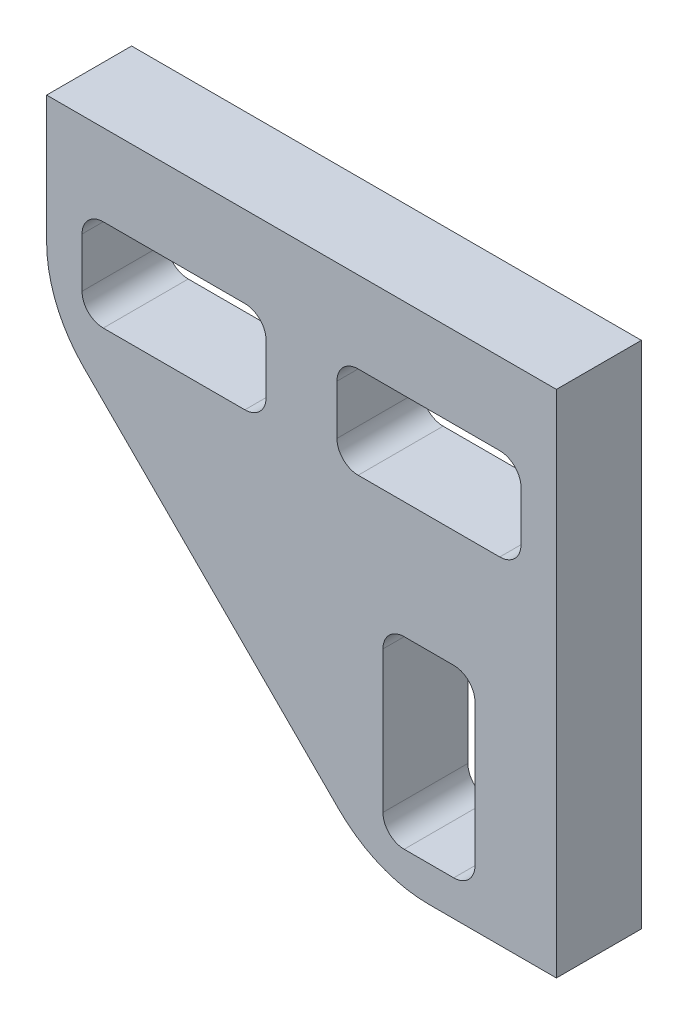
ISO-10303-21;
HEADER;
FILE_DESCRIPTION(('STEP AP214'),'2;1');
FILE_NAME('part.step','',(''),(''),'','','');
FILE_SCHEMA(('AUTOMOTIVE_DESIGN { 1 0 10303 214 1 1 1 1 }'));
ENDSEC;
DATA;
#1=APPLICATION_CONTEXT('core data for automotive mechanical design processes');
#2=APPLICATION_PROTOCOL_DEFINITION('international standard','automotive_design',2000,#1);
#3=PRODUCT_CONTEXT('',#1,'mechanical');
#4=PRODUCT('Part','Part','',(#3));
#5=PRODUCT_RELATED_PRODUCT_CATEGORY('part','',(#4));
#6=PRODUCT_DEFINITION_FORMATION('','',#4);
#7=PRODUCT_DEFINITION_CONTEXT('part definition',#1,'design');
#8=PRODUCT_DEFINITION('design','',#6,#7);
#9=PRODUCT_DEFINITION_SHAPE('','',#8);
#10=(LENGTH_UNIT() NAMED_UNIT(*) SI_UNIT(.MILLI.,.METRE.));
#11=(NAMED_UNIT(*) PLANE_ANGLE_UNIT() SI_UNIT($,.RADIAN.));
#12=(NAMED_UNIT(*) SI_UNIT($,.STERADIAN.) SOLID_ANGLE_UNIT());
#13=UNCERTAINTY_MEASURE_WITH_UNIT(LENGTH_MEASURE(1.E-05),#10,'distance_accuracy_value','');
#14=(GEOMETRIC_REPRESENTATION_CONTEXT(3) GLOBAL_UNCERTAINTY_ASSIGNED_CONTEXT((#13)) GLOBAL_UNIT_ASSIGNED_CONTEXT((#10,
#11,#12)) REPRESENTATION_CONTEXT('',''));
#15=CARTESIAN_POINT('',(0.,0.,0.));
#16=DIRECTION('',(0.,0.,1.));
#17=DIRECTION('',(1.,0.,0.));
#18=AXIS2_PLACEMENT_3D('',#15,#16,#17);
#19=CARTESIAN_POINT('',(149.3421335095,207.323953209079,3.));
#20=DIRECTION('',(0.,0.,1.));
#21=DIRECTION('',(1.,0.,0.));
#22=AXIS2_PLACEMENT_3D('',#19,#20,#21);
#23=PLANE('',#22);
#24=DIRECTION('',(1.,0.,0.));
#25=VECTOR('',#24,1.);
#26=CARTESIAN_POINT('',(151.8421335095,205.698953209,3.));
#27=LINE('',#26,#25);
#28=CARTESIAN_POINT('',(146.8421335095,205.698953209,3.));
#29=VERTEX_POINT('',#28);
#30=CARTESIAN_POINT('',(151.8421335095,205.698953209,3.));
#31=VERTEX_POINT('',#30);
#32=EDGE_CURVE('E303',#29,#31,#27,.T.);
#33=ORIENTED_EDGE('',*,*,#32,.F.);
#34=CARTESIAN_POINT('',(146.8421335095,206.448953209,3.));
#35=DIRECTION('',(0.,0.,1.));
#36=DIRECTION('',(1.,0.,0.));
#37=AXIS2_PLACEMENT_3D('',#34,#35,#36);
#38=CIRCLE('',#37,0.750000000000001);
#39=CARTESIAN_POINT('',(146.0921335095,206.448953209,3.));
#40=VERTEX_POINT('',#39);
#41=EDGE_CURVE('E301',#40,#29,#38,.T.);
#42=ORIENTED_EDGE('',*,*,#41,.F.);
#43=DIRECTION('',(0.,-1.,0.));
#44=VECTOR('',#43,1.);
#45=CARTESIAN_POINT('',(146.0921335095,206.448953209,3.));
#46=LINE('',#45,#44);
#47=CARTESIAN_POINT('',(146.0921335095,208.198953209,3.));
#48=VERTEX_POINT('',#47);
#49=EDGE_CURVE('E317',#48,#40,#46,.T.);
#50=ORIENTED_EDGE('',*,*,#49,.F.);
#51=CARTESIAN_POINT('',(146.8421335095,208.198953209,3.));
#52=DIRECTION('',(0.,0.,1.));
#53=DIRECTION('',(1.,0.,0.));
#54=AXIS2_PLACEMENT_3D('',#51,#52,#53);
#55=CIRCLE('',#54,0.750000000000001);
#56=CARTESIAN_POINT('',(146.8421335095,208.948953209,3.));
#57=VERTEX_POINT('',#56);
#58=EDGE_CURVE('E314',#57,#48,#55,.T.);
#59=ORIENTED_EDGE('',*,*,#58,.F.);
#60=DIRECTION('',(-1.,0.,0.));
#61=VECTOR('',#60,1.);
#62=CARTESIAN_POINT('',(146.8421335095,208.948953209,3.));
#63=LINE('',#62,#61);
#64=CARTESIAN_POINT('',(151.8421335095,208.948953209,3.));
#65=VERTEX_POINT('',#64);
#66=EDGE_CURVE('E312',#65,#57,#63,.T.);
#67=ORIENTED_EDGE('',*,*,#66,.F.);
#68=CARTESIAN_POINT('',(151.8421335095,208.198953209,3.));
#69=DIRECTION('',(0.,0.,1.));
#70=DIRECTION('',(1.,0.,0.));
#71=AXIS2_PLACEMENT_3D('',#68,#69,#70);
#72=CIRCLE('',#71,0.750000000000001);
#73=CARTESIAN_POINT('',(152.5921335095,208.198953209,3.));
#74=VERTEX_POINT('',#73);
#75=EDGE_CURVE('E310',#74,#65,#72,.T.);
#76=ORIENTED_EDGE('',*,*,#75,.F.);
#77=DIRECTION('',(0.,1.,0.));
#78=VECTOR('',#77,1.);
#79=CARTESIAN_POINT('',(152.5921335095,208.198953209,3.));
#80=LINE('',#79,#78);
#81=CARTESIAN_POINT('',(152.5921335095,206.448953209,3.));
#82=VERTEX_POINT('',#81);
#83=EDGE_CURVE('E308',#82,#74,#80,.T.);
#84=ORIENTED_EDGE('',*,*,#83,.F.);
#85=CARTESIAN_POINT('',(151.8421335095,206.448953209,3.));
#86=DIRECTION('',(0.,0.,1.));
#87=DIRECTION('',(1.,0.,0.));
#88=AXIS2_PLACEMENT_3D('',#85,#86,#87);
#89=CIRCLE('',#88,0.750000000000001);
#90=EDGE_CURVE('E306',#31,#82,#89,.T.);
#91=ORIENTED_EDGE('',*,*,#90,.F.);
#92=EDGE_LOOP('',(#33,#42,#50,#59,#67,#76,#84,#91));
#93=FACE_BOUND('',#92,.T.);
#94=CARTESIAN_POINT('',(149.3421335095,207.323953209079,3.));
#95=DIRECTION('',(0.,0.,1.));
#96=DIRECTION('',(1.,0.,0.));
#97=AXIS2_PLACEMENT_3D('',#94,#95,#96);
#98=CIRCLE('',#97,4.49999999999999);
#99=CARTESIAN_POINT('',(144.8421335095,207.323953209,3.));
#100=VERTEX_POINT('',#99);
#101=CARTESIAN_POINT('',(146.1601529942,204.1419726937,3.));
#102=VERTEX_POINT('',#101);
#103=EDGE_CURVE('E419',#100,#102,#98,.T.);
#104=ORIENTED_EDGE('',*,*,#103,.T.);
#105=DIRECTION('',(0.707106781186548,-0.707106781186548,0.));
#106=VECTOR('',#105,1.);
#107=CARTESIAN_POINT('',(146.1601529942,204.1419726937,3.));
#108=LINE('',#107,#106);
#109=CARTESIAN_POINT('',(155.1601529942,195.1419726937,3.));
#110=VERTEX_POINT('',#109);
#111=EDGE_CURVE('E422',#102,#110,#108,.T.);
#112=ORIENTED_EDGE('',*,*,#111,.T.);
#113=CARTESIAN_POINT('',(158.342133509579,198.323953209,3.));
#114=DIRECTION('',(0.,0.,1.));
#115=DIRECTION('',(1.,0.,0.));
#116=AXIS2_PLACEMENT_3D('',#113,#114,#115);
#117=CIRCLE('',#116,4.49999999999998);
#118=CARTESIAN_POINT('',(158.3421335095,193.823953209,3.));
#119=VERTEX_POINT('',#118);
#120=EDGE_CURVE('E425',#110,#119,#117,.T.);
#121=ORIENTED_EDGE('',*,*,#120,.T.);
#122=DIRECTION('',(1.,0.,0.));
#123=VECTOR('',#122,1.);
#124=CARTESIAN_POINT('',(158.3421335095,193.823953209,3.));
#125=LINE('',#124,#123);
#126=CARTESIAN_POINT('',(162.8421335095,193.823953209,3.));
#127=VERTEX_POINT('',#126);
#128=EDGE_CURVE('E427',#119,#127,#125,.T.);
#129=ORIENTED_EDGE('',*,*,#128,.T.);
#130=DIRECTION('',(0.,1.,0.));
#131=VECTOR('',#130,1.);
#132=CARTESIAN_POINT('',(162.8421335095,198.323953209,3.));
#133=LINE('',#132,#131);
#134=CARTESIAN_POINT('',(162.8421335095,211.823953209,3.));
#135=VERTEX_POINT('',#134);
#136=EDGE_CURVE('E429',#127,#135,#133,.T.);
#137=ORIENTED_EDGE('',*,*,#136,.T.);
#138=DIRECTION('',(-1.,0.,0.));
#139=VECTOR('',#138,1.);
#140=CARTESIAN_POINT('',(158.3421335095,211.823953209,3.));
#141=LINE('',#140,#139);
#142=CARTESIAN_POINT('',(144.8421335095,211.823953209,3.));
#143=VERTEX_POINT('',#142);
#144=EDGE_CURVE('E431',#135,#143,#141,.T.);
#145=ORIENTED_EDGE('',*,*,#144,.T.);
#146=DIRECTION('',(0.,-1.,0.));
#147=VECTOR('',#146,1.);
#148=CARTESIAN_POINT('',(144.8421335095,207.323953209,3.));
#149=LINE('',#148,#147);
#150=EDGE_CURVE('E433',#143,#100,#149,.T.);
#151=ORIENTED_EDGE('',*,*,#150,.T.);
#152=EDGE_LOOP('',(#104,#112,#121,#129,#137,#145,#151));
#153=FACE_BOUND('',#152,.T.);
#154=DIRECTION('',(0.,-1.,0.));
#155=VECTOR('',#154,1.);
#156=CARTESIAN_POINT('',(156.7171335095,195.823953209,3.));
#157=LINE('',#156,#155);
#158=CARTESIAN_POINT('',(156.7171335095,200.823953209,3.));
#159=VERTEX_POINT('',#158);
#160=CARTESIAN_POINT('',(156.7171335095,195.823953209,3.));
#161=VERTEX_POINT('',#160);
#162=EDGE_CURVE('E362',#159,#161,#157,.T.);
#163=ORIENTED_EDGE('',*,*,#162,.F.);
#164=CARTESIAN_POINT('',(157.4671335095,200.823953209,3.));
#165=DIRECTION('',(0.,0.,1.));
#166=DIRECTION('',(1.,0.,0.));
#167=AXIS2_PLACEMENT_3D('',#164,#165,#166);
#168=CIRCLE('',#167,0.750000000000001);
#169=CARTESIAN_POINT('',(157.4671335095,201.573953209,3.));
#170=VERTEX_POINT('',#169);
#171=EDGE_CURVE('E360',#170,#159,#168,.T.);
#172=ORIENTED_EDGE('',*,*,#171,.F.);
#173=DIRECTION('',(-1.,0.,0.));
#174=VECTOR('',#173,1.);
#175=CARTESIAN_POINT('',(157.4671335095,201.573953209,3.));
#176=LINE('',#175,#174);
#177=CARTESIAN_POINT('',(159.2171335095,201.573953209,3.));
#178=VERTEX_POINT('',#177);
#179=EDGE_CURVE('E376',#178,#170,#176,.T.);
#180=ORIENTED_EDGE('',*,*,#179,.F.);
#181=CARTESIAN_POINT('',(159.2171335095,200.823953209,3.));
#182=DIRECTION('',(0.,0.,1.));
#183=DIRECTION('',(1.,0.,0.));
#184=AXIS2_PLACEMENT_3D('',#181,#182,#183);
#185=CIRCLE('',#184,0.750000000000001);
#186=CARTESIAN_POINT('',(159.9671335095,200.823953209,3.));
#187=VERTEX_POINT('',#186);
#188=EDGE_CURVE('E373',#187,#178,#185,.T.);
#189=ORIENTED_EDGE('',*,*,#188,.F.);
#190=DIRECTION('',(0.,1.,0.));
#191=VECTOR('',#190,1.);
#192=CARTESIAN_POINT('',(159.9671335095,200.823953209,3.));
#193=LINE('',#192,#191);
#194=CARTESIAN_POINT('',(159.9671335095,195.823953209,3.));
#195=VERTEX_POINT('',#194);
#196=EDGE_CURVE('E371',#195,#187,#193,.T.);
#197=ORIENTED_EDGE('',*,*,#196,.F.);
#198=CARTESIAN_POINT('',(159.2171335095,195.823953209,3.));
#199=DIRECTION('',(0.,0.,1.));
#200=DIRECTION('',(1.,0.,0.));
#201=AXIS2_PLACEMENT_3D('',#198,#199,#200);
#202=CIRCLE('',#201,0.750000000000001);
#203=CARTESIAN_POINT('',(159.2171335095,195.073953209,3.));
#204=VERTEX_POINT('',#203);
#205=EDGE_CURVE('E369',#204,#195,#202,.T.);
#206=ORIENTED_EDGE('',*,*,#205,.F.);
#207=DIRECTION('',(1.,0.,0.));
#208=VECTOR('',#207,1.);
#209=CARTESIAN_POINT('',(159.2171335095,195.073953209,3.));
#210=LINE('',#209,#208);
#211=CARTESIAN_POINT('',(157.4671335095,195.073953209,3.));
#212=VERTEX_POINT('',#211);
#213=EDGE_CURVE('E367',#212,#204,#210,.T.);
#214=ORIENTED_EDGE('',*,*,#213,.F.);
#215=CARTESIAN_POINT('',(157.4671335095,195.823953209,3.));
#216=DIRECTION('',(0.,0.,1.));
#217=DIRECTION('',(1.,0.,0.));
#218=AXIS2_PLACEMENT_3D('',#215,#216,#217);
#219=CIRCLE('',#218,0.750000000000001);
#220=EDGE_CURVE('E365',#161,#212,#219,.T.);
#221=ORIENTED_EDGE('',*,*,#220,.F.);
#222=EDGE_LOOP('',(#163,#172,#180,#189,#197,#206,#214,#221));
#223=FACE_BOUND('',#222,.T.);
#224=DIRECTION('',(1.,0.,0.));
#225=VECTOR('',#224,1.);
#226=CARTESIAN_POINT('',(160.8421335095,205.698953209,3.));
#227=LINE('',#226,#225);
#228=CARTESIAN_POINT('',(155.8421335095,205.698953209,3.));
#229=VERTEX_POINT('',#228);
#230=CARTESIAN_POINT('',(160.8421335095,205.698953209,3.));
#231=VERTEX_POINT('',#230);
#232=EDGE_CURVE('E244',#229,#231,#227,.T.);
#233=ORIENTED_EDGE('',*,*,#232,.F.);
#234=CARTESIAN_POINT('',(155.8421335095,206.448953209,3.));
#235=DIRECTION('',(0.,0.,1.));
#236=DIRECTION('',(1.,0.,0.));
#237=AXIS2_PLACEMENT_3D('',#234,#235,#236);
#238=CIRCLE('',#237,0.749999999999987);
#239=CARTESIAN_POINT('',(155.0921335095,206.448953209,3.));
#240=VERTEX_POINT('',#239);
#241=EDGE_CURVE('E236',#240,#229,#238,.T.);
#242=ORIENTED_EDGE('',*,*,#241,.F.);
#243=DIRECTION('',(0.,-1.,0.));
#244=VECTOR('',#243,1.);
#245=CARTESIAN_POINT('',(155.0921335095,206.448953209,3.));
#246=LINE('',#245,#244);
#247=CARTESIAN_POINT('',(155.0921335095,208.198953209,3.));
#248=VERTEX_POINT('',#247);
#249=EDGE_CURVE('E269',#248,#240,#246,.T.);
#250=ORIENTED_EDGE('',*,*,#249,.F.);
#251=CARTESIAN_POINT('',(155.8421335095,208.198953209,3.));
#252=DIRECTION('',(0.,0.,1.));
#253=DIRECTION('',(1.,0.,0.));
#254=AXIS2_PLACEMENT_3D('',#251,#252,#253);
#255=CIRCLE('',#254,0.749999999999987);
#256=CARTESIAN_POINT('',(155.8421335095,208.948953209,3.));
#257=VERTEX_POINT('',#256);
#258=EDGE_CURVE('E267',#257,#248,#255,.T.);
#259=ORIENTED_EDGE('',*,*,#258,.F.);
#260=DIRECTION('',(-1.,0.,0.));
#261=VECTOR('',#260,1.);
#262=CARTESIAN_POINT('',(155.8421335095,208.948953209,3.));
#263=LINE('',#262,#261);
#264=CARTESIAN_POINT('',(160.8421335095,208.948953209,3.));
#265=VERTEX_POINT('',#264);
#266=EDGE_CURVE('E265',#265,#257,#263,.T.);
#267=ORIENTED_EDGE('',*,*,#266,.F.);
#268=CARTESIAN_POINT('',(160.8421335095,208.198953209,3.));
#269=DIRECTION('',(0.,0.,1.));
#270=DIRECTION('',(1.,0.,0.));
#271=AXIS2_PLACEMENT_3D('',#268,#269,#270);
#272=CIRCLE('',#271,0.750000000000001);
#273=CARTESIAN_POINT('',(161.5921335095,208.198953209,3.));
#274=VERTEX_POINT('',#273);
#275=EDGE_CURVE('E263',#274,#265,#272,.T.);
#276=ORIENTED_EDGE('',*,*,#275,.F.);
#277=DIRECTION('',(0.,1.,0.));
#278=VECTOR('',#277,1.);
#279=CARTESIAN_POINT('',(161.5921335095,208.198953209,3.));
#280=LINE('',#279,#278);
#281=CARTESIAN_POINT('',(161.5921335095,206.448953209,3.));
#282=VERTEX_POINT('',#281);
#283=EDGE_CURVE('E259',#282,#274,#280,.T.);
#284=ORIENTED_EDGE('',*,*,#283,.F.);
#285=CARTESIAN_POINT('',(160.8421335095,206.448953209,3.));
#286=DIRECTION('',(0.,0.,1.));
#287=DIRECTION('',(1.,0.,0.));
#288=AXIS2_PLACEMENT_3D('',#285,#286,#287);
#289=CIRCLE('',#288,0.750000000000001);
#290=EDGE_CURVE('E257',#231,#282,#289,.T.);
#291=ORIENTED_EDGE('',*,*,#290,.F.);
#292=EDGE_LOOP('',(#233,#242,#250,#259,#267,#276,#284,#291));
#293=FACE_BOUND('',#292,.T.);
#294=ADVANCED_FACE('F33',(#93,#153,#223,#293),#23,.T.);
#295=CARTESIAN_POINT('',(149.3421335095,207.323953209079,0.));
#296=DIRECTION('',(0.,0.,1.));
#297=DIRECTION('',(1.,0.,0.));
#298=AXIS2_PLACEMENT_3D('',#295,#296,#297);
#299=PLANE('',#298);
#300=CARTESIAN_POINT('',(146.8421335095,206.448953209,0.));
#301=DIRECTION('',(0.,0.,1.));
#302=DIRECTION('',(1.,0.,0.));
#303=AXIS2_PLACEMENT_3D('',#300,#301,#302);
#304=CIRCLE('',#303,0.750000000000001);
#305=CARTESIAN_POINT('',(146.0921335095,206.448953209,0.));
#306=VERTEX_POINT('',#305);
#307=CARTESIAN_POINT('',(146.8421335095,205.698953209,0.));
#308=VERTEX_POINT('',#307);
#309=EDGE_CURVE('E252',#306,#308,#304,.T.);
#310=ORIENTED_EDGE('',*,*,#309,.T.);
#311=DIRECTION('',(1.,0.,0.));
#312=VECTOR('',#311,1.);
#313=CARTESIAN_POINT('',(151.8421335095,205.698953209,0.));
#314=LINE('',#313,#312);
#315=CARTESIAN_POINT('',(151.8421335095,205.698953209,0.));
#316=VERTEX_POINT('',#315);
#317=EDGE_CURVE('E322',#308,#316,#314,.T.);
#318=ORIENTED_EDGE('',*,*,#317,.T.);
#319=CARTESIAN_POINT('',(151.8421335095,206.448953209,0.));
#320=DIRECTION('',(0.,0.,1.));
#321=DIRECTION('',(1.,0.,0.));
#322=AXIS2_PLACEMENT_3D('',#319,#320,#321);
#323=CIRCLE('',#322,0.750000000000001);
#324=CARTESIAN_POINT('',(152.5921335095,206.448953209,0.));
#325=VERTEX_POINT('',#324);
#326=EDGE_CURVE('E325',#316,#325,#323,.T.);
#327=ORIENTED_EDGE('',*,*,#326,.T.);
#328=DIRECTION('',(0.,1.,0.));
#329=VECTOR('',#328,1.);
#330=CARTESIAN_POINT('',(152.5921335095,208.198953209,0.));
#331=LINE('',#330,#329);
#332=CARTESIAN_POINT('',(152.5921335095,208.198953209,0.));
#333=VERTEX_POINT('',#332);
#334=EDGE_CURVE('E328',#325,#333,#331,.T.);
#335=ORIENTED_EDGE('',*,*,#334,.T.);
#336=CARTESIAN_POINT('',(151.8421335095,208.198953209,0.));
#337=DIRECTION('',(0.,0.,1.));
#338=DIRECTION('',(1.,0.,0.));
#339=AXIS2_PLACEMENT_3D('',#336,#337,#338);
#340=CIRCLE('',#339,0.750000000000001);
#341=CARTESIAN_POINT('',(151.8421335095,208.948953209,0.));
#342=VERTEX_POINT('',#341);
#343=EDGE_CURVE('E331',#333,#342,#340,.T.);
#344=ORIENTED_EDGE('',*,*,#343,.T.);
#345=DIRECTION('',(-1.,0.,0.));
#346=VECTOR('',#345,1.);
#347=CARTESIAN_POINT('',(146.8421335095,208.948953209,0.));
#348=LINE('',#347,#346);
#349=CARTESIAN_POINT('',(146.8421335095,208.948953209,0.));
#350=VERTEX_POINT('',#349);
#351=EDGE_CURVE('E334',#342,#350,#348,.T.);
#352=ORIENTED_EDGE('',*,*,#351,.T.);
#353=CARTESIAN_POINT('',(146.8421335095,208.198953209,0.));
#354=DIRECTION('',(0.,0.,1.));
#355=DIRECTION('',(1.,0.,0.));
#356=AXIS2_PLACEMENT_3D('',#353,#354,#355);
#357=CIRCLE('',#356,0.750000000000001);
#358=CARTESIAN_POINT('',(146.0921335095,208.198953209,0.));
#359=VERTEX_POINT('',#358);
#360=EDGE_CURVE('E337',#350,#359,#357,.T.);
#361=ORIENTED_EDGE('',*,*,#360,.T.);
#362=DIRECTION('',(0.,-1.,0.));
#363=VECTOR('',#362,1.);
#364=CARTESIAN_POINT('',(146.0921335095,206.448953209,0.));
#365=LINE('',#364,#363);
#366=EDGE_CURVE('E304',#359,#306,#365,.T.);
#367=ORIENTED_EDGE('',*,*,#366,.T.);
#368=EDGE_LOOP('',(#310,#318,#327,#335,#344,#352,#361,#367));
#369=FACE_BOUND('',#368,.T.);
#370=CARTESIAN_POINT('',(149.3421335095,207.323953209079,0.));
#371=DIRECTION('',(0.,0.,1.));
#372=DIRECTION('',(1.,0.,0.));
#373=AXIS2_PLACEMENT_3D('',#370,#371,#372);
#374=CIRCLE('',#373,4.49999999999999);
#375=CARTESIAN_POINT('',(144.8421335095,207.323953209,0.));
#376=VERTEX_POINT('',#375);
#377=CARTESIAN_POINT('',(146.1601529942,204.1419726937,0.));
#378=VERTEX_POINT('',#377);
#379=EDGE_CURVE('E418',#376,#378,#374,.T.);
#380=ORIENTED_EDGE('',*,*,#379,.F.);
#381=DIRECTION('',(0.,-1.,0.));
#382=VECTOR('',#381,1.);
#383=CARTESIAN_POINT('',(144.8421335095,207.323953209,0.));
#384=LINE('',#383,#382);
#385=CARTESIAN_POINT('',(144.8421335095,211.823953209,0.));
#386=VERTEX_POINT('',#385);
#387=EDGE_CURVE('E423',#386,#376,#384,.T.);
#388=ORIENTED_EDGE('',*,*,#387,.F.);
#389=DIRECTION('',(-1.,0.,0.));
#390=VECTOR('',#389,1.);
#391=CARTESIAN_POINT('',(149.3421335095,211.823953209,0.));
#392=LINE('',#391,#390);
#393=CARTESIAN_POINT('',(162.8421335095,211.823953209,0.));
#394=VERTEX_POINT('',#393);
#395=EDGE_CURVE('E448',#394,#386,#392,.T.);
#396=ORIENTED_EDGE('',*,*,#395,.F.);
#397=DIRECTION('',(0.,1.,0.));
#398=VECTOR('',#397,1.);
#399=CARTESIAN_POINT('',(162.8421335095,198.323953209,0.));
#400=LINE('',#399,#398);
#401=CARTESIAN_POINT('',(162.8421335095,193.823953209,0.));
#402=VERTEX_POINT('',#401);
#403=EDGE_CURVE('E445',#402,#394,#400,.T.);
#404=ORIENTED_EDGE('',*,*,#403,.F.);
#405=DIRECTION('',(1.,0.,0.));
#406=VECTOR('',#405,1.);
#407=CARTESIAN_POINT('',(158.3421335095,193.823953209,0.));
#408=LINE('',#407,#406);
#409=CARTESIAN_POINT('',(158.3421335095,193.823953209,0.));
#410=VERTEX_POINT('',#409);
#411=EDGE_CURVE('E442',#410,#402,#408,.T.);
#412=ORIENTED_EDGE('',*,*,#411,.F.);
#413=CARTESIAN_POINT('',(158.342133509579,198.323953209,0.));
#414=DIRECTION('',(0.,0.,1.));
#415=DIRECTION('',(1.,0.,0.));
#416=AXIS2_PLACEMENT_3D('',#413,#414,#415);
#417=CIRCLE('',#416,4.49999999999998);
#418=CARTESIAN_POINT('',(155.1601529942,195.1419726937,0.));
#419=VERTEX_POINT('',#418);
#420=EDGE_CURVE('E440',#419,#410,#417,.T.);
#421=ORIENTED_EDGE('',*,*,#420,.F.);
#422=DIRECTION('',(0.707106781186548,-0.707106781186548,0.));
#423=VECTOR('',#422,1.);
#424=CARTESIAN_POINT('',(146.1601529942,204.1419726937,0.));
#425=LINE('',#424,#423);
#426=EDGE_CURVE('E438',#378,#419,#425,.T.);
#427=ORIENTED_EDGE('',*,*,#426,.F.);
#428=EDGE_LOOP('',(#380,#388,#396,#404,#412,#421,#427));
#429=FACE_BOUND('',#428,.T.);
#430=CARTESIAN_POINT('',(157.4671335095,200.823953209,0.));
#431=DIRECTION('',(0.,0.,1.));
#432=DIRECTION('',(1.,0.,0.));
#433=AXIS2_PLACEMENT_3D('',#430,#431,#432);
#434=CIRCLE('',#433,0.750000000000001);
#435=CARTESIAN_POINT('',(157.4671335095,201.573953209,0.));
#436=VERTEX_POINT('',#435);
#437=CARTESIAN_POINT('',(156.7171335095,200.823953209,0.));
#438=VERTEX_POINT('',#437);
#439=EDGE_CURVE('E359',#436,#438,#434,.T.);
#440=ORIENTED_EDGE('',*,*,#439,.T.);
#441=DIRECTION('',(0.,-1.,0.));
#442=VECTOR('',#441,1.);
#443=CARTESIAN_POINT('',(156.7171335095,195.823953209,0.));
#444=LINE('',#443,#442);
#445=CARTESIAN_POINT('',(156.7171335095,195.823953209,0.));
#446=VERTEX_POINT('',#445);
#447=EDGE_CURVE('E381',#438,#446,#444,.T.);
#448=ORIENTED_EDGE('',*,*,#447,.T.);
#449=CARTESIAN_POINT('',(157.4671335095,195.823953209,0.));
#450=DIRECTION('',(0.,0.,1.));
#451=DIRECTION('',(1.,0.,0.));
#452=AXIS2_PLACEMENT_3D('',#449,#450,#451);
#453=CIRCLE('',#452,0.750000000000001);
#454=CARTESIAN_POINT('',(157.4671335095,195.073953209,0.));
#455=VERTEX_POINT('',#454);
#456=EDGE_CURVE('E384',#446,#455,#453,.T.);
#457=ORIENTED_EDGE('',*,*,#456,.T.);
#458=DIRECTION('',(1.,0.,0.));
#459=VECTOR('',#458,1.);
#460=CARTESIAN_POINT('',(159.2171335095,195.073953209,0.));
#461=LINE('',#460,#459);
#462=CARTESIAN_POINT('',(159.2171335095,195.073953209,0.));
#463=VERTEX_POINT('',#462);
#464=EDGE_CURVE('E387',#455,#463,#461,.T.);
#465=ORIENTED_EDGE('',*,*,#464,.T.);
#466=CARTESIAN_POINT('',(159.2171335095,195.823953209,0.));
#467=DIRECTION('',(0.,0.,1.));
#468=DIRECTION('',(1.,0.,0.));
#469=AXIS2_PLACEMENT_3D('',#466,#467,#468);
#470=CIRCLE('',#469,0.750000000000001);
#471=CARTESIAN_POINT('',(159.9671335095,195.823953209,0.));
#472=VERTEX_POINT('',#471);
#473=EDGE_CURVE('E390',#463,#472,#470,.T.);
#474=ORIENTED_EDGE('',*,*,#473,.T.);
#475=DIRECTION('',(0.,1.,0.));
#476=VECTOR('',#475,1.);
#477=CARTESIAN_POINT('',(159.9671335095,200.823953209,0.));
#478=LINE('',#477,#476);
#479=CARTESIAN_POINT('',(159.9671335095,200.823953209,0.));
#480=VERTEX_POINT('',#479);
#481=EDGE_CURVE('E393',#472,#480,#478,.T.);
#482=ORIENTED_EDGE('',*,*,#481,.T.);
#483=CARTESIAN_POINT('',(159.2171335095,200.823953209,0.));
#484=DIRECTION('',(0.,0.,1.));
#485=DIRECTION('',(1.,0.,0.));
#486=AXIS2_PLACEMENT_3D('',#483,#484,#485);
#487=CIRCLE('',#486,0.750000000000001);
#488=CARTESIAN_POINT('',(159.2171335095,201.573953209,0.));
#489=VERTEX_POINT('',#488);
#490=EDGE_CURVE('E396',#480,#489,#487,.T.);
#491=ORIENTED_EDGE('',*,*,#490,.T.);
#492=DIRECTION('',(-1.,0.,0.));
#493=VECTOR('',#492,1.);
#494=CARTESIAN_POINT('',(157.4671335095,201.573953209,0.));
#495=LINE('',#494,#493);
#496=EDGE_CURVE('E363',#489,#436,#495,.T.);
#497=ORIENTED_EDGE('',*,*,#496,.T.);
#498=EDGE_LOOP('',(#440,#448,#457,#465,#474,#482,#491,#497));
#499=FACE_BOUND('',#498,.T.);
#500=CARTESIAN_POINT('',(155.8421335095,206.448953209,0.));
#501=DIRECTION('',(0.,0.,1.));
#502=DIRECTION('',(1.,0.,0.));
#503=AXIS2_PLACEMENT_3D('',#500,#501,#502);
#504=CIRCLE('',#503,0.749999999999987);
#505=CARTESIAN_POINT('',(155.0921335095,206.448953209,0.));
#506=VERTEX_POINT('',#505);
#507=CARTESIAN_POINT('',(155.8421335095,205.698953209,0.));
#508=VERTEX_POINT('',#507);
#509=EDGE_CURVE('E56',#506,#508,#504,.T.);
#510=ORIENTED_EDGE('',*,*,#509,.T.);
#511=DIRECTION('',(1.,0.,0.));
#512=VECTOR('',#511,1.);
#513=CARTESIAN_POINT('',(160.8421335095,205.698953209,0.));
#514=LINE('',#513,#512);
#515=CARTESIAN_POINT('',(160.8421335095,205.698953209,0.));
#516=VERTEX_POINT('',#515);
#517=EDGE_CURVE('E251',#508,#516,#514,.T.);
#518=ORIENTED_EDGE('',*,*,#517,.T.);
#519=CARTESIAN_POINT('',(160.8421335095,206.448953209,0.));
#520=DIRECTION('',(0.,0.,1.));
#521=DIRECTION('',(1.,0.,0.));
#522=AXIS2_PLACEMENT_3D('',#519,#520,#521);
#523=CIRCLE('',#522,0.750000000000001);
#524=CARTESIAN_POINT('',(161.5921335095,206.448953209,0.));
#525=VERTEX_POINT('',#524);
#526=EDGE_CURVE('E273',#516,#525,#523,.T.);
#527=ORIENTED_EDGE('',*,*,#526,.T.);
#528=DIRECTION('',(0.,1.,0.));
#529=VECTOR('',#528,1.);
#530=CARTESIAN_POINT('',(161.5921335095,208.198953209,0.));
#531=LINE('',#530,#529);
#532=CARTESIAN_POINT('',(161.5921335095,208.198953209,0.));
#533=VERTEX_POINT('',#532);
#534=EDGE_CURVE('E276',#525,#533,#531,.T.);
#535=ORIENTED_EDGE('',*,*,#534,.T.);
#536=CARTESIAN_POINT('',(160.8421335095,208.198953209,0.));
#537=DIRECTION('',(0.,0.,1.));
#538=DIRECTION('',(1.,0.,0.));
#539=AXIS2_PLACEMENT_3D('',#536,#537,#538);
#540=CIRCLE('',#539,0.750000000000001);
#541=CARTESIAN_POINT('',(160.8421335095,208.948953209,0.));
#542=VERTEX_POINT('',#541);
#543=EDGE_CURVE('E279',#533,#542,#540,.T.);
#544=ORIENTED_EDGE('',*,*,#543,.T.);
#545=DIRECTION('',(-1.,0.,0.));
#546=VECTOR('',#545,1.);
#547=CARTESIAN_POINT('',(155.8421335095,208.948953209,0.));
#548=LINE('',#547,#546);
#549=CARTESIAN_POINT('',(155.8421335095,208.948953209,0.));
#550=VERTEX_POINT('',#549);
#551=EDGE_CURVE('E282',#542,#550,#548,.T.);
#552=ORIENTED_EDGE('',*,*,#551,.T.);
#553=CARTESIAN_POINT('',(155.8421335095,208.198953209,0.));
#554=DIRECTION('',(0.,0.,1.));
#555=DIRECTION('',(1.,0.,0.));
#556=AXIS2_PLACEMENT_3D('',#553,#554,#555);
#557=CIRCLE('',#556,0.749999999999987);
#558=CARTESIAN_POINT('',(155.0921335095,208.198953209,0.));
#559=VERTEX_POINT('',#558);
#560=EDGE_CURVE('E285',#550,#559,#557,.T.);
#561=ORIENTED_EDGE('',*,*,#560,.T.);
#562=DIRECTION('',(0.,-1.,0.));
#563=VECTOR('',#562,1.);
#564=CARTESIAN_POINT('',(155.0921335095,206.448953209,0.));
#565=LINE('',#564,#563);
#566=EDGE_CURVE('E245',#559,#506,#565,.T.);
#567=ORIENTED_EDGE('',*,*,#566,.T.);
#568=EDGE_LOOP('',(#510,#518,#527,#535,#544,#552,#561,#567));
#569=FACE_BOUND('',#568,.T.);
#570=ADVANCED_FACE('F475',(#369,#429,#499,#569),#299,.F.);
#571=CARTESIAN_POINT('',(149.3421335095,207.323953209079,3.));
#572=DIRECTION('',(0.,0.,-1.));
#573=DIRECTION('',(-1.,0.,0.));
#574=AXIS2_PLACEMENT_3D('',#571,#572,#573);
#575=CYLINDRICAL_SURFACE('',#574,4.49999999999999);
#576=ORIENTED_EDGE('',*,*,#379,.T.);
#577=DIRECTION('',(0.,0.,-1.));
#578=VECTOR('',#577,1.);
#579=CARTESIAN_POINT('',(146.1601529942,204.1419726937,3.));
#580=LINE('',#579,#578);
#581=EDGE_CURVE('E11',#102,#378,#580,.T.);
#582=ORIENTED_EDGE('',*,*,#581,.F.);
#583=ORIENTED_EDGE('',*,*,#103,.F.);
#584=DIRECTION('',(0.,0.,-1.));
#585=VECTOR('',#584,1.);
#586=CARTESIAN_POINT('',(144.8421335095,207.323953209,3.));
#587=LINE('',#586,#585);
#588=EDGE_CURVE('E435',#100,#376,#587,.T.);
#589=ORIENTED_EDGE('',*,*,#588,.T.);
#590=EDGE_LOOP('',(#576,#582,#583,#589));
#591=FACE_BOUND('',#590,.T.);
#592=ADVANCED_FACE('F35',(#591),#575,.T.);
#593=CARTESIAN_POINT('',(146.1601529942,204.1419726937,3.));
#594=DIRECTION('',(0.707106781186547,0.707106781186547,0.));
#595=DIRECTION('',(-0.707106781186548,0.707106781186548,0.));
#596=AXIS2_PLACEMENT_3D('',#593,#594,#595);
#597=PLANE('',#596);
#598=ORIENTED_EDGE('',*,*,#426,.T.);
#599=DIRECTION('',(0.,0.,-1.));
#600=VECTOR('',#599,1.);
#601=CARTESIAN_POINT('',(155.1601529942,195.1419726937,3.));
#602=LINE('',#601,#600);
#603=EDGE_CURVE('E41',#110,#419,#602,.T.);
#604=ORIENTED_EDGE('',*,*,#603,.F.);
#605=ORIENTED_EDGE('',*,*,#111,.F.);
#606=ORIENTED_EDGE('',*,*,#581,.T.);
#607=EDGE_LOOP('',(#598,#604,#605,#606));
#608=FACE_BOUND('',#607,.T.);
#609=ADVANCED_FACE('F491',(#608),#597,.F.);
#610=CARTESIAN_POINT('',(158.342133509579,198.323953209,3.));
#611=DIRECTION('',(0.,0.,-1.));
#612=DIRECTION('',(-1.,0.,0.));
#613=AXIS2_PLACEMENT_3D('',#610,#611,#612);
#614=CYLINDRICAL_SURFACE('',#613,4.49999999999998);
#615=ORIENTED_EDGE('',*,*,#420,.T.);
#616=DIRECTION('',(0.,0.,-1.));
#617=VECTOR('',#616,1.);
#618=CARTESIAN_POINT('',(158.3421335095,193.823953209,3.));
#619=LINE('',#618,#617);
#620=EDGE_CURVE('E462',#119,#410,#619,.T.);
#621=ORIENTED_EDGE('',*,*,#620,.F.);
#622=ORIENTED_EDGE('',*,*,#120,.F.);
#623=ORIENTED_EDGE('',*,*,#603,.T.);
#624=EDGE_LOOP('',(#615,#621,#622,#623));
#625=FACE_BOUND('',#624,.T.);
#626=ADVANCED_FACE('F469',(#625),#614,.T.);
#627=CARTESIAN_POINT('',(158.3421335095,193.823953209,3.));
#628=DIRECTION('',(0.,1.,0.));
#629=DIRECTION('',(0.,0.,1.));
#630=AXIS2_PLACEMENT_3D('',#627,#628,#629);
#631=PLANE('',#630);
#632=ORIENTED_EDGE('',*,*,#411,.T.);
#633=DIRECTION('',(0.,0.,-1.));
#634=VECTOR('',#633,1.);
#635=CARTESIAN_POINT('',(162.8421335095,193.823953209,3.));
#636=LINE('',#635,#634);
#637=EDGE_CURVE('E459',#127,#402,#636,.T.);
#638=ORIENTED_EDGE('',*,*,#637,.F.);
#639=ORIENTED_EDGE('',*,*,#128,.F.);
#640=ORIENTED_EDGE('',*,*,#620,.T.);
#641=EDGE_LOOP('',(#632,#638,#639,#640));
#642=FACE_BOUND('',#641,.T.);
#643=ADVANCED_FACE('F479',(#642),#631,.F.);
#644=CARTESIAN_POINT('',(162.8421335095,198.323953209,3.));
#645=DIRECTION('',(-1.,0.,0.));
#646=DIRECTION('',(0.,0.,1.));
#647=AXIS2_PLACEMENT_3D('',#644,#645,#646);
#648=PLANE('',#647);
#649=ORIENTED_EDGE('',*,*,#403,.T.);
#650=DIRECTION('',(0.,0.,-1.));
#651=VECTOR('',#650,1.);
#652=CARTESIAN_POINT('',(162.8421335095,211.823953209,3.));
#653=LINE('',#652,#651);
#654=EDGE_CURVE('E456',#135,#394,#653,.T.);
#655=ORIENTED_EDGE('',*,*,#654,.F.);
#656=ORIENTED_EDGE('',*,*,#136,.F.);
#657=ORIENTED_EDGE('',*,*,#637,.T.);
#658=EDGE_LOOP('',(#649,#655,#656,#657));
#659=FACE_BOUND('',#658,.T.);
#660=ADVANCED_FACE('F483',(#659),#648,.F.);
#661=CARTESIAN_POINT('',(149.3421335095,211.823953209,3.));
#662=DIRECTION('',(0.,-1.,0.));
#663=DIRECTION('',(0.,0.,-1.));
#664=AXIS2_PLACEMENT_3D('',#661,#662,#663);
#665=PLANE('',#664);
#666=ORIENTED_EDGE('',*,*,#395,.T.);
#667=DIRECTION('',(0.,0.,-1.));
#668=VECTOR('',#667,1.);
#669=CARTESIAN_POINT('',(144.8421335095,211.823953209,3.));
#670=LINE('',#669,#668);
#671=EDGE_CURVE('E453',#143,#386,#670,.T.);
#672=ORIENTED_EDGE('',*,*,#671,.F.);
#673=ORIENTED_EDGE('',*,*,#144,.F.);
#674=ORIENTED_EDGE('',*,*,#654,.T.);
#675=EDGE_LOOP('',(#666,#672,#673,#674));
#676=FACE_BOUND('',#675,.T.);
#677=ADVANCED_FACE('F499',(#676),#665,.F.);
#678=CARTESIAN_POINT('',(144.8421335095,207.323953209,3.));
#679=DIRECTION('',(1.,0.,0.));
#680=DIRECTION('',(0.,0.,-1.));
#681=AXIS2_PLACEMENT_3D('',#678,#679,#680);
#682=PLANE('',#681);
#683=ORIENTED_EDGE('',*,*,#387,.T.);
#684=ORIENTED_EDGE('',*,*,#588,.F.);
#685=ORIENTED_EDGE('',*,*,#150,.F.);
#686=ORIENTED_EDGE('',*,*,#671,.T.);
#687=EDGE_LOOP('',(#683,#684,#685,#686));
#688=FACE_BOUND('',#687,.T.);
#689=ADVANCED_FACE('F496',(#688),#682,.F.);
#690=CARTESIAN_POINT('',(157.4671335095,200.823953209,3.));
#691=DIRECTION('',(0.,0.,-1.));
#692=DIRECTION('',(-1.,0.,0.));
#693=AXIS2_PLACEMENT_3D('',#690,#691,#692);
#694=CYLINDRICAL_SURFACE('',#693,0.750000000000001);
#695=ORIENTED_EDGE('',*,*,#439,.F.);
#696=DIRECTION('',(0.,0.,-1.));
#697=VECTOR('',#696,1.);
#698=CARTESIAN_POINT('',(157.4671335095,201.573953209,3.));
#699=LINE('',#698,#697);
#700=EDGE_CURVE('E378',#170,#436,#699,.T.);
#701=ORIENTED_EDGE('',*,*,#700,.F.);
#702=ORIENTED_EDGE('',*,*,#171,.T.);
#703=DIRECTION('',(0.,0.,-1.));
#704=VECTOR('',#703,1.);
#705=CARTESIAN_POINT('',(156.7171335095,200.823953209,3.));
#706=LINE('',#705,#704);
#707=EDGE_CURVE('E415',#159,#438,#706,.T.);
#708=ORIENTED_EDGE('',*,*,#707,.T.);
#709=EDGE_LOOP('',(#695,#701,#702,#708));
#710=FACE_BOUND('',#709,.T.);
#711=ADVANCED_FACE('F506',(#710),#694,.F.);
#712=CARTESIAN_POINT('',(156.7171335095,195.823953209,3.));
#713=DIRECTION('',(1.,0.,0.));
#714=DIRECTION('',(0.,0.,-1.));
#715=AXIS2_PLACEMENT_3D('',#712,#713,#714);
#716=PLANE('',#715);
#717=ORIENTED_EDGE('',*,*,#447,.F.);
#718=ORIENTED_EDGE('',*,*,#707,.F.);
#719=ORIENTED_EDGE('',*,*,#162,.T.);
#720=DIRECTION('',(0.,0.,-1.));
#721=VECTOR('',#720,1.);
#722=CARTESIAN_POINT('',(156.7171335095,195.823953209,3.));
#723=LINE('',#722,#721);
#724=EDGE_CURVE('E413',#161,#446,#723,.T.);
#725=ORIENTED_EDGE('',*,*,#724,.T.);
#726=EDGE_LOOP('',(#717,#718,#719,#725));
#727=FACE_BOUND('',#726,.T.);
#728=ADVANCED_FACE('F521',(#727),#716,.T.);
#729=CARTESIAN_POINT('',(157.4671335095,195.823953209,3.));
#730=DIRECTION('',(0.,0.,-1.));
#731=DIRECTION('',(-1.,0.,0.));
#732=AXIS2_PLACEMENT_3D('',#729,#730,#731);
#733=CYLINDRICAL_SURFACE('',#732,0.750000000000001);
#734=ORIENTED_EDGE('',*,*,#456,.F.);
#735=ORIENTED_EDGE('',*,*,#724,.F.);
#736=ORIENTED_EDGE('',*,*,#220,.T.);
#737=DIRECTION('',(0.,0.,-1.));
#738=VECTOR('',#737,1.);
#739=CARTESIAN_POINT('',(157.4671335095,195.073953209,3.));
#740=LINE('',#739,#738);
#741=EDGE_CURVE('E411',#212,#455,#740,.T.);
#742=ORIENTED_EDGE('',*,*,#741,.T.);
#743=EDGE_LOOP('',(#734,#735,#736,#742));
#744=FACE_BOUND('',#743,.T.);
#745=ADVANCED_FACE('F525',(#744),#733,.F.);
#746=CARTESIAN_POINT('',(159.2171335095,195.073953209,3.));
#747=DIRECTION('',(0.,1.,0.));
#748=DIRECTION('',(0.,0.,1.));
#749=AXIS2_PLACEMENT_3D('',#746,#747,#748);
#750=PLANE('',#749);
#751=ORIENTED_EDGE('',*,*,#464,.F.);
#752=ORIENTED_EDGE('',*,*,#741,.F.);
#753=ORIENTED_EDGE('',*,*,#213,.T.);
#754=DIRECTION('',(0.,0.,-1.));
#755=VECTOR('',#754,1.);
#756=CARTESIAN_POINT('',(159.2171335095,195.073953209,3.));
#757=LINE('',#756,#755);
#758=EDGE_CURVE('E409',#204,#463,#757,.T.);
#759=ORIENTED_EDGE('',*,*,#758,.T.);
#760=EDGE_LOOP('',(#751,#752,#753,#759));
#761=FACE_BOUND('',#760,.T.);
#762=ADVANCED_FACE('F529',(#761),#750,.T.);
#763=CARTESIAN_POINT('',(159.2171335095,195.823953209,3.));
#764=DIRECTION('',(0.,0.,-1.));
#765=DIRECTION('',(-1.,0.,0.));
#766=AXIS2_PLACEMENT_3D('',#763,#764,#765);
#767=CYLINDRICAL_SURFACE('',#766,0.750000000000001);
#768=ORIENTED_EDGE('',*,*,#473,.F.);
#769=ORIENTED_EDGE('',*,*,#758,.F.);
#770=ORIENTED_EDGE('',*,*,#205,.T.);
#771=DIRECTION('',(0.,0.,-1.));
#772=VECTOR('',#771,1.);
#773=CARTESIAN_POINT('',(159.9671335095,195.823953209,3.));
#774=LINE('',#773,#772);
#775=EDGE_CURVE('E407',#195,#472,#774,.T.);
#776=ORIENTED_EDGE('',*,*,#775,.T.);
#777=EDGE_LOOP('',(#768,#769,#770,#776));
#778=FACE_BOUND('',#777,.T.);
#779=ADVANCED_FACE('F533',(#778),#767,.F.);
#780=CARTESIAN_POINT('',(159.9671335095,200.823953209,3.));
#781=DIRECTION('',(-1.,0.,0.));
#782=DIRECTION('',(0.,0.,1.));
#783=AXIS2_PLACEMENT_3D('',#780,#781,#782);
#784=PLANE('',#783);
#785=ORIENTED_EDGE('',*,*,#481,.F.);
#786=ORIENTED_EDGE('',*,*,#775,.F.);
#787=ORIENTED_EDGE('',*,*,#196,.T.);
#788=DIRECTION('',(0.,0.,-1.));
#789=VECTOR('',#788,1.);
#790=CARTESIAN_POINT('',(159.9671335095,200.823953209,3.));
#791=LINE('',#790,#789);
#792=EDGE_CURVE('E405',#187,#480,#791,.T.);
#793=ORIENTED_EDGE('',*,*,#792,.T.);
#794=EDGE_LOOP('',(#785,#786,#787,#793));
#795=FACE_BOUND('',#794,.T.);
#796=ADVANCED_FACE('F537',(#795),#784,.T.);
#797=CARTESIAN_POINT('',(159.2171335095,200.823953209,3.));
#798=DIRECTION('',(0.,0.,-1.));
#799=DIRECTION('',(-1.,0.,0.));
#800=AXIS2_PLACEMENT_3D('',#797,#798,#799);
#801=CYLINDRICAL_SURFACE('',#800,0.750000000000001);
#802=ORIENTED_EDGE('',*,*,#490,.F.);
#803=ORIENTED_EDGE('',*,*,#792,.F.);
#804=ORIENTED_EDGE('',*,*,#188,.T.);
#805=DIRECTION('',(0.,0.,-1.));
#806=VECTOR('',#805,1.);
#807=CARTESIAN_POINT('',(159.2171335095,201.573953209,3.));
#808=LINE('',#807,#806);
#809=EDGE_CURVE('E403',#178,#489,#808,.T.);
#810=ORIENTED_EDGE('',*,*,#809,.T.);
#811=EDGE_LOOP('',(#802,#803,#804,#810));
#812=FACE_BOUND('',#811,.T.);
#813=ADVANCED_FACE('F541',(#812),#801,.F.);
#814=CARTESIAN_POINT('',(157.4671335095,201.573953209,3.));
#815=DIRECTION('',(0.,-1.,0.));
#816=DIRECTION('',(0.,0.,-1.));
#817=AXIS2_PLACEMENT_3D('',#814,#815,#816);
#818=PLANE('',#817);
#819=ORIENTED_EDGE('',*,*,#496,.F.);
#820=ORIENTED_EDGE('',*,*,#809,.F.);
#821=ORIENTED_EDGE('',*,*,#179,.T.);
#822=ORIENTED_EDGE('',*,*,#700,.T.);
#823=EDGE_LOOP('',(#819,#820,#821,#822));
#824=FACE_BOUND('',#823,.T.);
#825=ADVANCED_FACE('F545',(#824),#818,.T.);
#826=CARTESIAN_POINT('',(146.8421335095,206.448953209,3.));
#827=DIRECTION('',(0.,0.,-1.));
#828=DIRECTION('',(-1.,0.,0.));
#829=AXIS2_PLACEMENT_3D('',#826,#827,#828);
#830=CYLINDRICAL_SURFACE('',#829,0.750000000000001);
#831=ORIENTED_EDGE('',*,*,#309,.F.);
#832=DIRECTION('',(0.,0.,-1.));
#833=VECTOR('',#832,1.);
#834=CARTESIAN_POINT('',(146.0921335095,206.448953209,3.));
#835=LINE('',#834,#833);
#836=EDGE_CURVE('E319',#40,#306,#835,.T.);
#837=ORIENTED_EDGE('',*,*,#836,.F.);
#838=ORIENTED_EDGE('',*,*,#41,.T.);
#839=DIRECTION('',(0.,0.,-1.));
#840=VECTOR('',#839,1.);
#841=CARTESIAN_POINT('',(146.8421335095,205.698953209,3.));
#842=LINE('',#841,#840);
#843=EDGE_CURVE('E356',#29,#308,#842,.T.);
#844=ORIENTED_EDGE('',*,*,#843,.T.);
#845=EDGE_LOOP('',(#831,#837,#838,#844));
#846=FACE_BOUND('',#845,.T.);
#847=ADVANCED_FACE('F549',(#846),#830,.F.);
#848=CARTESIAN_POINT('',(151.8421335095,205.698953209,3.));
#849=DIRECTION('',(0.,1.,0.));
#850=DIRECTION('',(0.,0.,1.));
#851=AXIS2_PLACEMENT_3D('',#848,#849,#850);
#852=PLANE('',#851);
#853=ORIENTED_EDGE('',*,*,#317,.F.);
#854=ORIENTED_EDGE('',*,*,#843,.F.);
#855=ORIENTED_EDGE('',*,*,#32,.T.);
#856=DIRECTION('',(0.,0.,-1.));
#857=VECTOR('',#856,1.);
#858=CARTESIAN_POINT('',(151.8421335095,205.698953209,3.));
#859=LINE('',#858,#857);
#860=EDGE_CURVE('E354',#31,#316,#859,.T.);
#861=ORIENTED_EDGE('',*,*,#860,.T.);
#862=EDGE_LOOP('',(#853,#854,#855,#861));
#863=FACE_BOUND('',#862,.T.);
#864=ADVANCED_FACE('F553',(#863),#852,.T.);
#865=CARTESIAN_POINT('',(151.8421335095,206.448953209,3.));
#866=DIRECTION('',(0.,0.,-1.));
#867=DIRECTION('',(-1.,0.,0.));
#868=AXIS2_PLACEMENT_3D('',#865,#866,#867);
#869=CYLINDRICAL_SURFACE('',#868,0.750000000000001);
#870=ORIENTED_EDGE('',*,*,#326,.F.);
#871=ORIENTED_EDGE('',*,*,#860,.F.);
#872=ORIENTED_EDGE('',*,*,#90,.T.);
#873=DIRECTION('',(0.,0.,-1.));
#874=VECTOR('',#873,1.);
#875=CARTESIAN_POINT('',(152.5921335095,206.448953209,3.));
#876=LINE('',#875,#874);
#877=EDGE_CURVE('E352',#82,#325,#876,.T.);
#878=ORIENTED_EDGE('',*,*,#877,.T.);
#879=EDGE_LOOP('',(#870,#871,#872,#878));
#880=FACE_BOUND('',#879,.T.);
#881=ADVANCED_FACE('F557',(#880),#869,.F.);
#882=CARTESIAN_POINT('',(152.5921335095,208.198953209,3.));
#883=DIRECTION('',(-1.,0.,0.));
#884=DIRECTION('',(0.,0.,1.));
#885=AXIS2_PLACEMENT_3D('',#882,#883,#884);
#886=PLANE('',#885);
#887=ORIENTED_EDGE('',*,*,#334,.F.);
#888=ORIENTED_EDGE('',*,*,#877,.F.);
#889=ORIENTED_EDGE('',*,*,#83,.T.);
#890=DIRECTION('',(0.,0.,-1.));
#891=VECTOR('',#890,1.);
#892=CARTESIAN_POINT('',(152.5921335095,208.198953209,3.));
#893=LINE('',#892,#891);
#894=EDGE_CURVE('E350',#74,#333,#893,.T.);
#895=ORIENTED_EDGE('',*,*,#894,.T.);
#896=EDGE_LOOP('',(#887,#888,#889,#895));
#897=FACE_BOUND('',#896,.T.);
#898=ADVANCED_FACE('F561',(#897),#886,.T.);
#899=CARTESIAN_POINT('',(151.8421335095,208.198953209,3.));
#900=DIRECTION('',(0.,0.,-1.));
#901=DIRECTION('',(-1.,0.,0.));
#902=AXIS2_PLACEMENT_3D('',#899,#900,#901);
#903=CYLINDRICAL_SURFACE('',#902,0.750000000000001);
#904=ORIENTED_EDGE('',*,*,#343,.F.);
#905=ORIENTED_EDGE('',*,*,#894,.F.);
#906=ORIENTED_EDGE('',*,*,#75,.T.);
#907=DIRECTION('',(0.,0.,-1.));
#908=VECTOR('',#907,1.);
#909=CARTESIAN_POINT('',(151.8421335095,208.948953209,3.));
#910=LINE('',#909,#908);
#911=EDGE_CURVE('E348',#65,#342,#910,.T.);
#912=ORIENTED_EDGE('',*,*,#911,.T.);
#913=EDGE_LOOP('',(#904,#905,#906,#912));
#914=FACE_BOUND('',#913,.T.);
#915=ADVANCED_FACE('F565',(#914),#903,.F.);
#916=CARTESIAN_POINT('',(146.8421335095,208.948953209,3.));
#917=DIRECTION('',(0.,-1.,0.));
#918=DIRECTION('',(0.,0.,-1.));
#919=AXIS2_PLACEMENT_3D('',#916,#917,#918);
#920=PLANE('',#919);
#921=ORIENTED_EDGE('',*,*,#351,.F.);
#922=ORIENTED_EDGE('',*,*,#911,.F.);
#923=ORIENTED_EDGE('',*,*,#66,.T.);
#924=DIRECTION('',(0.,0.,-1.));
#925=VECTOR('',#924,1.);
#926=CARTESIAN_POINT('',(146.8421335095,208.948953209,3.));
#927=LINE('',#926,#925);
#928=EDGE_CURVE('E346',#57,#350,#927,.T.);
#929=ORIENTED_EDGE('',*,*,#928,.T.);
#930=EDGE_LOOP('',(#921,#922,#923,#929));
#931=FACE_BOUND('',#930,.T.);
#932=ADVANCED_FACE('F569',(#931),#920,.T.);
#933=CARTESIAN_POINT('',(146.8421335095,208.198953209,3.));
#934=DIRECTION('',(0.,0.,-1.));
#935=DIRECTION('',(-1.,0.,0.));
#936=AXIS2_PLACEMENT_3D('',#933,#934,#935);
#937=CYLINDRICAL_SURFACE('',#936,0.750000000000001);
#938=ORIENTED_EDGE('',*,*,#360,.F.);
#939=ORIENTED_EDGE('',*,*,#928,.F.);
#940=ORIENTED_EDGE('',*,*,#58,.T.);
#941=DIRECTION('',(0.,0.,-1.));
#942=VECTOR('',#941,1.);
#943=CARTESIAN_POINT('',(146.0921335095,208.198953209,3.));
#944=LINE('',#943,#942);
#945=EDGE_CURVE('E344',#48,#359,#944,.T.);
#946=ORIENTED_EDGE('',*,*,#945,.T.);
#947=EDGE_LOOP('',(#938,#939,#940,#946));
#948=FACE_BOUND('',#947,.T.);
#949=ADVANCED_FACE('F573',(#948),#937,.F.);
#950=CARTESIAN_POINT('',(146.0921335095,206.448953209,3.));
#951=DIRECTION('',(1.,0.,0.));
#952=DIRECTION('',(0.,0.,-1.));
#953=AXIS2_PLACEMENT_3D('',#950,#951,#952);
#954=PLANE('',#953);
#955=ORIENTED_EDGE('',*,*,#366,.F.);
#956=ORIENTED_EDGE('',*,*,#945,.F.);
#957=ORIENTED_EDGE('',*,*,#49,.T.);
#958=ORIENTED_EDGE('',*,*,#836,.T.);
#959=EDGE_LOOP('',(#955,#956,#957,#958));
#960=FACE_BOUND('',#959,.T.);
#961=ADVANCED_FACE('F577',(#960),#954,.T.);
#962=CARTESIAN_POINT('',(155.8421335095,206.448953209,3.));
#963=DIRECTION('',(0.,0.,-1.));
#964=DIRECTION('',(-1.,0.,0.));
#965=AXIS2_PLACEMENT_3D('',#962,#963,#964);
#966=CYLINDRICAL_SURFACE('',#965,0.749999999999987);
#967=ORIENTED_EDGE('',*,*,#509,.F.);
#968=DIRECTION('',(0.,0.,-1.));
#969=VECTOR('',#968,1.);
#970=CARTESIAN_POINT('',(155.0921335095,206.448953209,3.));
#971=LINE('',#970,#969);
#972=EDGE_CURVE('E240',#240,#506,#971,.T.);
#973=ORIENTED_EDGE('',*,*,#972,.F.);
#974=ORIENTED_EDGE('',*,*,#241,.T.);
#975=DIRECTION('',(0.,0.,-1.));
#976=VECTOR('',#975,1.);
#977=CARTESIAN_POINT('',(155.8421335095,205.698953209,3.));
#978=LINE('',#977,#976);
#979=EDGE_CURVE('E239',#229,#508,#978,.T.);
#980=ORIENTED_EDGE('',*,*,#979,.T.);
#981=EDGE_LOOP('',(#967,#973,#974,#980));
#982=FACE_BOUND('',#981,.T.);
#983=ADVANCED_FACE('F238',(#982),#966,.F.);
#984=CARTESIAN_POINT('',(160.8421335095,205.698953209,3.));
#985=DIRECTION('',(0.,1.,0.));
#986=DIRECTION('',(0.,0.,1.));
#987=AXIS2_PLACEMENT_3D('',#984,#985,#986);
#988=PLANE('',#987);
#989=ORIENTED_EDGE('',*,*,#517,.F.);
#990=ORIENTED_EDGE('',*,*,#979,.F.);
#991=ORIENTED_EDGE('',*,*,#232,.T.);
#992=DIRECTION('',(0.,0.,-1.));
#993=VECTOR('',#992,1.);
#994=CARTESIAN_POINT('',(160.8421335095,205.698953209,3.));
#995=LINE('',#994,#993);
#996=EDGE_CURVE('E253',#231,#516,#995,.T.);
#997=ORIENTED_EDGE('',*,*,#996,.T.);
#998=EDGE_LOOP('',(#989,#990,#991,#997));
#999=FACE_BOUND('',#998,.T.);
#1000=ADVANCED_FACE('F248',(#999),#988,.T.);
#1001=CARTESIAN_POINT('',(160.8421335095,206.448953209,3.));
#1002=DIRECTION('',(0.,0.,-1.));
#1003=DIRECTION('',(-1.,0.,0.));
#1004=AXIS2_PLACEMENT_3D('',#1001,#1002,#1003);
#1005=CYLINDRICAL_SURFACE('',#1004,0.750000000000001);
#1006=ORIENTED_EDGE('',*,*,#526,.F.);
#1007=ORIENTED_EDGE('',*,*,#996,.F.);
#1008=ORIENTED_EDGE('',*,*,#290,.T.);
#1009=DIRECTION('',(0.,0.,-1.));
#1010=VECTOR('',#1009,1.);
#1011=CARTESIAN_POINT('',(161.5921335095,206.448953209,3.));
#1012=LINE('',#1011,#1010);
#1013=EDGE_CURVE('E298',#282,#525,#1012,.T.);
#1014=ORIENTED_EDGE('',*,*,#1013,.T.);
#1015=EDGE_LOOP('',(#1006,#1007,#1008,#1014));
#1016=FACE_BOUND('',#1015,.T.);
#1017=ADVANCED_FACE('F586',(#1016),#1005,.F.);
#1018=CARTESIAN_POINT('',(161.5921335095,208.198953209,3.));
#1019=DIRECTION('',(-1.,0.,0.));
#1020=DIRECTION('',(0.,0.,1.));
#1021=AXIS2_PLACEMENT_3D('',#1018,#1019,#1020);
#1022=PLANE('',#1021);
#1023=ORIENTED_EDGE('',*,*,#534,.F.);
#1024=ORIENTED_EDGE('',*,*,#1013,.F.);
#1025=ORIENTED_EDGE('',*,*,#283,.T.);
#1026=DIRECTION('',(0.,0.,-1.));
#1027=VECTOR('',#1026,1.);
#1028=CARTESIAN_POINT('',(161.5921335095,208.198953209,3.));
#1029=LINE('',#1028,#1027);
#1030=EDGE_CURVE('E296',#274,#533,#1029,.T.);
#1031=ORIENTED_EDGE('',*,*,#1030,.T.);
#1032=EDGE_LOOP('',(#1023,#1024,#1025,#1031));
#1033=FACE_BOUND('',#1032,.T.);
#1034=ADVANCED_FACE('F589',(#1033),#1022,.T.);
#1035=CARTESIAN_POINT('',(160.8421335095,208.198953209,3.));
#1036=DIRECTION('',(0.,0.,-1.));
#1037=DIRECTION('',(-1.,0.,0.));
#1038=AXIS2_PLACEMENT_3D('',#1035,#1036,#1037);
#1039=CYLINDRICAL_SURFACE('',#1038,0.750000000000001);
#1040=ORIENTED_EDGE('',*,*,#543,.F.);
#1041=ORIENTED_EDGE('',*,*,#1030,.F.);
#1042=ORIENTED_EDGE('',*,*,#275,.T.);
#1043=DIRECTION('',(0.,0.,-1.));
#1044=VECTOR('',#1043,1.);
#1045=CARTESIAN_POINT('',(160.8421335095,208.948953209,3.));
#1046=LINE('',#1045,#1044);
#1047=EDGE_CURVE('E294',#265,#542,#1046,.T.);
#1048=ORIENTED_EDGE('',*,*,#1047,.T.);
#1049=EDGE_LOOP('',(#1040,#1041,#1042,#1048));
#1050=FACE_BOUND('',#1049,.T.);
#1051=ADVANCED_FACE('F593',(#1050),#1039,.F.);
#1052=CARTESIAN_POINT('',(155.8421335095,208.948953209,3.));
#1053=DIRECTION('',(0.,-1.,0.));
#1054=DIRECTION('',(0.,0.,-1.));
#1055=AXIS2_PLACEMENT_3D('',#1052,#1053,#1054);
#1056=PLANE('',#1055);
#1057=ORIENTED_EDGE('',*,*,#551,.F.);
#1058=ORIENTED_EDGE('',*,*,#1047,.F.);
#1059=ORIENTED_EDGE('',*,*,#266,.T.);
#1060=DIRECTION('',(0.,0.,-1.));
#1061=VECTOR('',#1060,1.);
#1062=CARTESIAN_POINT('',(155.8421335095,208.948953209,3.));
#1063=LINE('',#1062,#1061);
#1064=EDGE_CURVE('E292',#257,#550,#1063,.T.);
#1065=ORIENTED_EDGE('',*,*,#1064,.T.);
#1066=EDGE_LOOP('',(#1057,#1058,#1059,#1065));
#1067=FACE_BOUND('',#1066,.T.);
#1068=ADVANCED_FACE('F597',(#1067),#1056,.T.);
#1069=CARTESIAN_POINT('',(155.8421335095,208.198953209,3.));
#1070=DIRECTION('',(0.,0.,-1.));
#1071=DIRECTION('',(-1.,0.,0.));
#1072=AXIS2_PLACEMENT_3D('',#1069,#1070,#1071);
#1073=CYLINDRICAL_SURFACE('',#1072,0.749999999999987);
#1074=ORIENTED_EDGE('',*,*,#560,.F.);
#1075=ORIENTED_EDGE('',*,*,#1064,.F.);
#1076=ORIENTED_EDGE('',*,*,#258,.T.);
#1077=DIRECTION('',(0.,0.,-1.));
#1078=VECTOR('',#1077,1.);
#1079=CARTESIAN_POINT('',(155.0921335095,208.198953209,3.));
#1080=LINE('',#1079,#1078);
#1081=EDGE_CURVE('E48',#248,#559,#1080,.T.);
#1082=ORIENTED_EDGE('',*,*,#1081,.T.);
#1083=EDGE_LOOP('',(#1074,#1075,#1076,#1082));
#1084=FACE_BOUND('',#1083,.T.);
#1085=ADVANCED_FACE('F601',(#1084),#1073,.F.);
#1086=CARTESIAN_POINT('',(155.0921335095,206.448953209,3.));
#1087=DIRECTION('',(1.,0.,0.));
#1088=DIRECTION('',(0.,0.,-1.));
#1089=AXIS2_PLACEMENT_3D('',#1086,#1087,#1088);
#1090=PLANE('',#1089);
#1091=ORIENTED_EDGE('',*,*,#566,.F.);
#1092=ORIENTED_EDGE('',*,*,#1081,.F.);
#1093=ORIENTED_EDGE('',*,*,#249,.T.);
#1094=ORIENTED_EDGE('',*,*,#972,.T.);
#1095=EDGE_LOOP('',(#1091,#1092,#1093,#1094));
#1096=FACE_BOUND('',#1095,.T.);
#1097=ADVANCED_FACE('F605',(#1096),#1090,.T.);
#1098=CLOSED_SHELL('',(#294,#570,#592,#609,#626,#643,#660,#677,#689,#711,#728,#745,#762,#779,
#796,#813,#825,#847,#864,#881,#898,#915,#932,#949,#961,#983,#1000,#1017,#1034,#1051,#1068,#1085,#1097));
#1099=MANIFOLD_SOLID_BREP('B2',#1098);
#1100=ADVANCED_BREP_SHAPE_REPRESENTATION('',(#18,#1099),#14);
#1101=SHAPE_DEFINITION_REPRESENTATION(#9,#1100);
ENDSEC;
END-ISO-10303-21;
